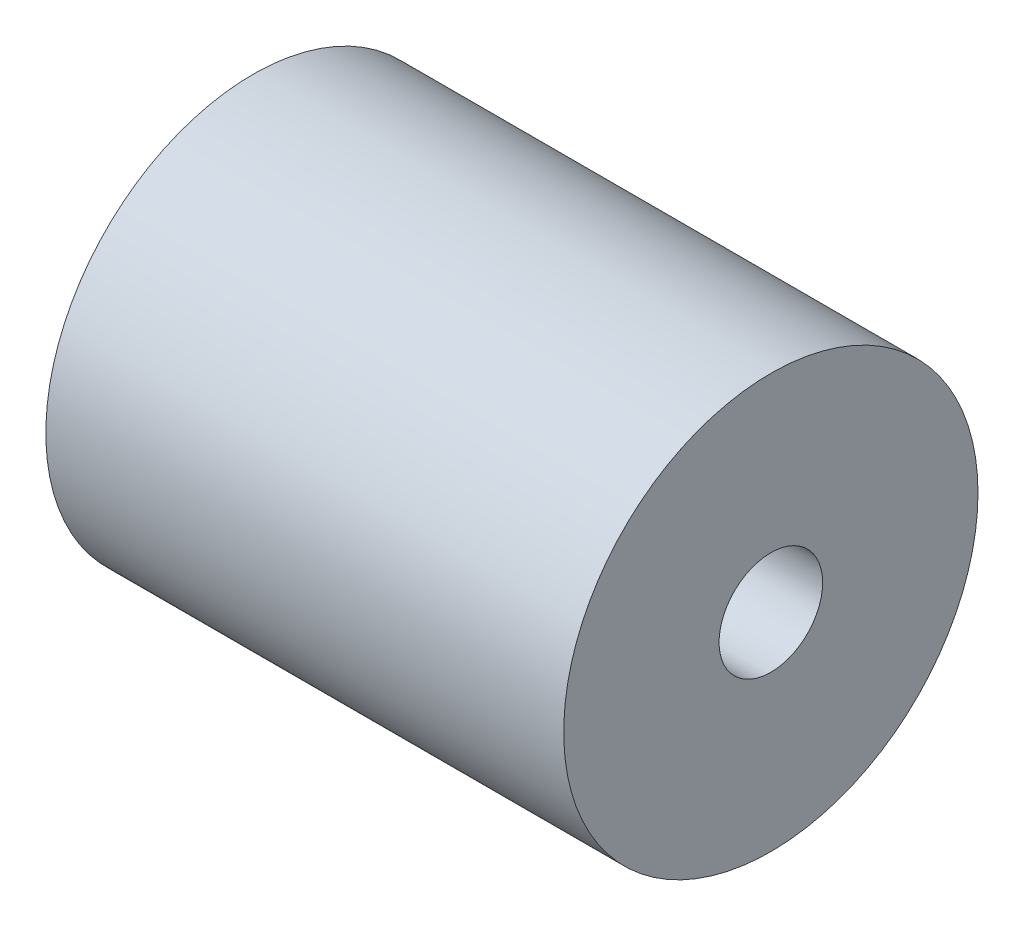
ISO-10303-21;
HEADER;
FILE_DESCRIPTION(('STEP AP214'),'2;1');
FILE_NAME('part.step','',(''),(''),'','','');
FILE_SCHEMA(('AUTOMOTIVE_DESIGN { 1 0 10303 214 1 1 1 1 }'));
ENDSEC;
DATA;
#1=APPLICATION_CONTEXT('core data for automotive mechanical design processes');
#2=APPLICATION_PROTOCOL_DEFINITION('international standard','automotive_design',2000,#1);
#3=PRODUCT_CONTEXT('',#1,'mechanical');
#4=PRODUCT('Part','Part','',(#3));
#5=PRODUCT_RELATED_PRODUCT_CATEGORY('part','',(#4));
#6=PRODUCT_DEFINITION_FORMATION('','',#4);
#7=PRODUCT_DEFINITION_CONTEXT('part definition',#1,'design');
#8=PRODUCT_DEFINITION('design','',#6,#7);
#9=PRODUCT_DEFINITION_SHAPE('','',#8);
#10=(LENGTH_UNIT() NAMED_UNIT(*) SI_UNIT(.MILLI.,.METRE.));
#11=(NAMED_UNIT(*) PLANE_ANGLE_UNIT() SI_UNIT($,.RADIAN.));
#12=(NAMED_UNIT(*) SI_UNIT($,.STERADIAN.) SOLID_ANGLE_UNIT());
#13=UNCERTAINTY_MEASURE_WITH_UNIT(LENGTH_MEASURE(1.E-05),#10,'distance_accuracy_value','');
#14=(GEOMETRIC_REPRESENTATION_CONTEXT(3) GLOBAL_UNCERTAINTY_ASSIGNED_CONTEXT((#13)) GLOBAL_UNIT_ASSIGNED_CONTEXT((#10,
#11,#12)) REPRESENTATION_CONTEXT('',''));
#15=CARTESIAN_POINT('',(0.,0.,0.));
#16=DIRECTION('',(0.,0.,1.));
#17=DIRECTION('',(1.,0.,0.));
#18=AXIS2_PLACEMENT_3D('',#15,#16,#17);
#19=CARTESIAN_POINT('',(12.5,0.,0.));
#20=DIRECTION('',(-1.,0.,0.));
#21=DIRECTION('',(0.,0.,1.));
#22=AXIS2_PLACEMENT_3D('',#19,#20,#21);
#23=CYLINDRICAL_SURFACE('',#22,10.);
#24=CARTESIAN_POINT('',(12.5,0.,0.));
#25=DIRECTION('',(1.,0.,0.));
#26=DIRECTION('',(0.,0.,-1.));
#27=AXIS2_PLACEMENT_3D('',#24,#25,#26);
#28=CIRCLE('',#27,10.);
#29=CARTESIAN_POINT('',(12.5,0.,-10.));
#30=VERTEX_POINT('',#29);
#31=EDGE_CURVE('E10',#30,#30,#28,.T.);
#32=ORIENTED_EDGE('',*,*,#31,.F.);
#33=EDGE_LOOP('',(#32));
#34=FACE_BOUND('',#33,.T.);
#35=CARTESIAN_POINT('',(-12.5,0.,0.));
#36=DIRECTION('',(1.,0.,0.));
#37=DIRECTION('',(0.,0.,-1.));
#38=AXIS2_PLACEMENT_3D('',#35,#36,#37);
#39=CIRCLE('',#38,10.);
#40=CARTESIAN_POINT('',(-12.5,0.,-10.));
#41=VERTEX_POINT('',#40);
#42=EDGE_CURVE('E34',#41,#41,#39,.T.);
#43=ORIENTED_EDGE('',*,*,#42,.T.);
#44=EDGE_LOOP('',(#43));
#45=FACE_BOUND('',#44,.T.);
#46=ADVANCED_FACE('F31',(#34,#45),#23,.T.);
#47=CARTESIAN_POINT('',(12.5,0.,0.));
#48=DIRECTION('',(1.,0.,0.));
#49=DIRECTION('',(0.,0.,-1.));
#50=AXIS2_PLACEMENT_3D('',#47,#48,#49);
#51=PLANE('',#50);
#52=CARTESIAN_POINT('',(12.5,0.,0.));
#53=DIRECTION('',(1.,0.,0.));
#54=DIRECTION('',(0.,0.,-1.));
#55=AXIS2_PLACEMENT_3D('',#52,#53,#54);
#56=CIRCLE('',#55,2.5);
#57=CARTESIAN_POINT('',(12.5,0.,-2.5));
#58=VERTEX_POINT('',#57);
#59=EDGE_CURVE('E41',#58,#58,#56,.T.);
#60=ORIENTED_EDGE('',*,*,#59,.F.);
#61=EDGE_LOOP('',(#60));
#62=FACE_BOUND('',#61,.T.);
#63=ORIENTED_EDGE('',*,*,#31,.T.);
#64=EDGE_LOOP('',(#63));
#65=FACE_BOUND('',#64,.T.);
#66=ADVANCED_FACE('F68',(#62,#65),#51,.T.);
#67=CARTESIAN_POINT('',(-12.5,0.,0.));
#68=DIRECTION('',(1.,0.,0.));
#69=DIRECTION('',(0.,0.,-1.));
#70=AXIS2_PLACEMENT_3D('',#67,#68,#69);
#71=PLANE('',#70);
#72=CARTESIAN_POINT('',(-12.5,0.,0.));
#73=DIRECTION('',(-1.,0.,0.));
#74=DIRECTION('',(0.,0.,1.));
#75=AXIS2_PLACEMENT_3D('',#72,#73,#74);
#76=CIRCLE('',#75,4.);
#77=CARTESIAN_POINT('',(-12.5,0.,4.));
#78=VERTEX_POINT('',#77);
#79=EDGE_CURVE('E49',#78,#78,#76,.T.);
#80=ORIENTED_EDGE('',*,*,#79,.F.);
#81=EDGE_LOOP('',(#80));
#82=FACE_BOUND('',#81,.T.);
#83=ORIENTED_EDGE('',*,*,#42,.F.);
#84=EDGE_LOOP('',(#83));
#85=FACE_BOUND('',#84,.T.);
#86=ADVANCED_FACE('F64',(#82,#85),#71,.F.);
#87=CARTESIAN_POINT('',(0.,0.,0.));
#88=DIRECTION('',(1.,0.,0.));
#89=DIRECTION('',(0.,0.,-1.));
#90=AXIS2_PLACEMENT_3D('',#87,#88,#89);
#91=CYLINDRICAL_SURFACE('',#90,2.5);
#92=CARTESIAN_POINT('',(0.,0.,0.));
#93=DIRECTION('',(1.,0.,0.));
#94=DIRECTION('',(0.,0.,-1.));
#95=AXIS2_PLACEMENT_3D('',#92,#93,#94);
#96=CIRCLE('',#95,2.5);
#97=CARTESIAN_POINT('',(0.,0.,-2.5));
#98=VERTEX_POINT('',#97);
#99=EDGE_CURVE('E45',#98,#98,#96,.T.);
#100=ORIENTED_EDGE('',*,*,#99,.F.);
#101=EDGE_LOOP('',(#100));
#102=FACE_BOUND('',#101,.T.);
#103=ORIENTED_EDGE('',*,*,#59,.T.);
#104=EDGE_LOOP('',(#103));
#105=FACE_BOUND('',#104,.T.);
#106=ADVANCED_FACE('F67',(#102,#105),#91,.F.);
#107=CARTESIAN_POINT('',(0.,0.,0.));
#108=DIRECTION('',(-1.,0.,0.));
#109=DIRECTION('',(0.,0.,1.));
#110=AXIS2_PLACEMENT_3D('',#107,#108,#109);
#111=PLANE('',#110);
#112=CARTESIAN_POINT('',(0.,0.,0.));
#113=DIRECTION('',(-1.,0.,0.));
#114=DIRECTION('',(0.,0.,1.));
#115=AXIS2_PLACEMENT_3D('',#112,#113,#114);
#116=CIRCLE('',#115,4.);
#117=CARTESIAN_POINT('',(0.,0.,4.));
#118=VERTEX_POINT('',#117);
#119=EDGE_CURVE('E48',#118,#118,#116,.T.);
#120=ORIENTED_EDGE('',*,*,#119,.T.);
#121=EDGE_LOOP('',(#120));
#122=FACE_BOUND('',#121,.T.);
#123=ORIENTED_EDGE('',*,*,#99,.T.);
#124=EDGE_LOOP('',(#123));
#125=FACE_BOUND('',#124,.T.);
#126=ADVANCED_FACE('F55',(#122,#125),#111,.T.);
#127=CARTESIAN_POINT('',(0.,0.,0.));
#128=DIRECTION('',(-1.,0.,0.));
#129=DIRECTION('',(0.,0.,1.));
#130=AXIS2_PLACEMENT_3D('',#127,#128,#129);
#131=CYLINDRICAL_SURFACE('',#130,4.);
#132=ORIENTED_EDGE('',*,*,#119,.F.);
#133=EDGE_LOOP('',(#132));
#134=FACE_BOUND('',#133,.T.);
#135=ORIENTED_EDGE('',*,*,#79,.T.);
#136=EDGE_LOOP('',(#135));
#137=FACE_BOUND('',#136,.T.);
#138=ADVANCED_FACE('F58',(#134,#137),#131,.F.);
#139=CLOSED_SHELL('',(#46,#66,#86,#106,#126,#138));
#140=MANIFOLD_SOLID_BREP('B2',#139);
#141=ADVANCED_BREP_SHAPE_REPRESENTATION('',(#18,#140),#14);
#142=SHAPE_DEFINITION_REPRESENTATION(#9,#141);
ENDSEC;
END-ISO-10303-21;
